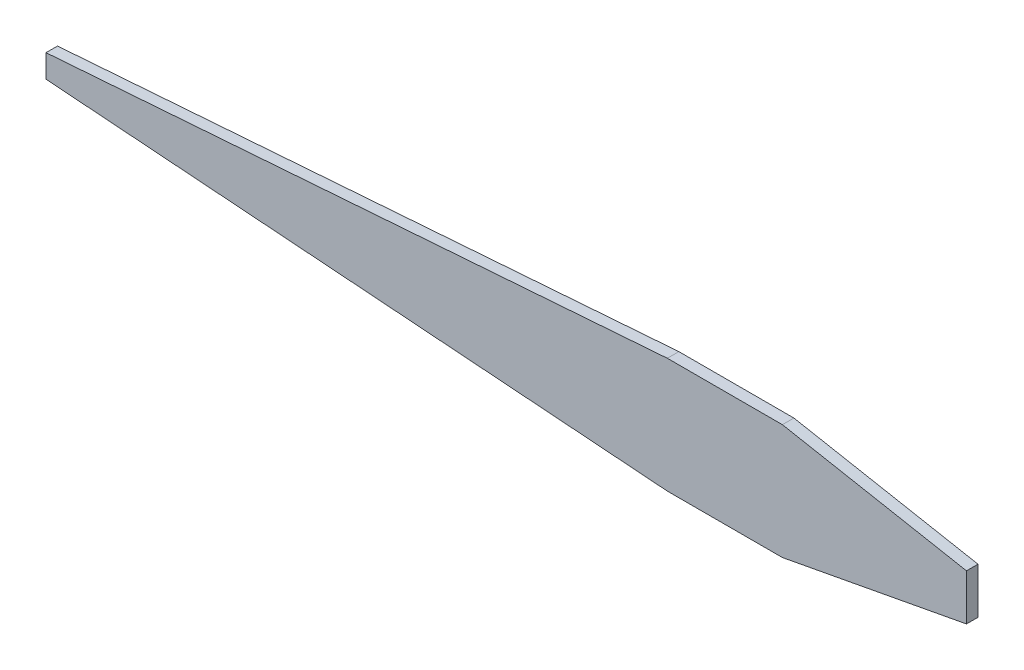
ISO-10303-21;
HEADER;
FILE_DESCRIPTION(('STEP AP214'),'2;1');
FILE_NAME('part.step','',(''),(''),'','','');
FILE_SCHEMA(('AUTOMOTIVE_DESIGN { 1 0 10303 214 1 1 1 1 }'));
ENDSEC;
DATA;
#1=APPLICATION_CONTEXT('core data for automotive mechanical design processes');
#2=APPLICATION_PROTOCOL_DEFINITION('international standard','automotive_design',2000,#1);
#3=PRODUCT_CONTEXT('',#1,'mechanical');
#4=PRODUCT('Part','Part','',(#3));
#5=PRODUCT_RELATED_PRODUCT_CATEGORY('part','',(#4));
#6=PRODUCT_DEFINITION_FORMATION('','',#4);
#7=PRODUCT_DEFINITION_CONTEXT('part definition',#1,'design');
#8=PRODUCT_DEFINITION('design','',#6,#7);
#9=PRODUCT_DEFINITION_SHAPE('','',#8);
#10=(LENGTH_UNIT() NAMED_UNIT(*) SI_UNIT(.MILLI.,.METRE.));
#11=(NAMED_UNIT(*) PLANE_ANGLE_UNIT() SI_UNIT($,.RADIAN.));
#12=(NAMED_UNIT(*) SI_UNIT($,.STERADIAN.) SOLID_ANGLE_UNIT());
#13=UNCERTAINTY_MEASURE_WITH_UNIT(LENGTH_MEASURE(1.E-05),#10,'distance_accuracy_value','');
#14=(GEOMETRIC_REPRESENTATION_CONTEXT(3) GLOBAL_UNCERTAINTY_ASSIGNED_CONTEXT((#13)) GLOBAL_UNIT_ASSIGNED_CONTEXT((#10,
#11,#12)) REPRESENTATION_CONTEXT('',''));
#15=CARTESIAN_POINT('',(0.,0.,0.));
#16=DIRECTION('',(0.,0.,1.));
#17=DIRECTION('',(1.,0.,0.));
#18=AXIS2_PLACEMENT_3D('',#15,#16,#17);
#19=CARTESIAN_POINT('',(200.,-20.,5.));
#20=DIRECTION('',(-1.,0.,0.));
#21=DIRECTION('',(0.,0.,1.));
#22=AXIS2_PLACEMENT_3D('',#19,#20,#21);
#23=PLANE('',#22);
#24=DIRECTION('',(0.,1.,0.));
#25=VECTOR('',#24,1.);
#26=CARTESIAN_POINT('',(200.,-20.,-5.));
#27=LINE('',#26,#25);
#28=CARTESIAN_POINT('',(200.,-20.,-5.));
#29=VERTEX_POINT('',#28);
#30=CARTESIAN_POINT('',(200.,20.,-5.));
#31=VERTEX_POINT('',#30);
#32=EDGE_CURVE('E133',#29,#31,#27,.T.);
#33=ORIENTED_EDGE('',*,*,#32,.T.);
#34=DIRECTION('',(0.,0.,-1.));
#35=VECTOR('',#34,1.);
#36=CARTESIAN_POINT('',(200.,20.,5.));
#37=LINE('',#36,#35);
#38=CARTESIAN_POINT('',(200.,20.,5.));
#39=VERTEX_POINT('',#38);
#40=EDGE_CURVE('E11',#39,#31,#37,.T.);
#41=ORIENTED_EDGE('',*,*,#40,.F.);
#42=DIRECTION('',(0.,1.,0.));
#43=VECTOR('',#42,1.);
#44=CARTESIAN_POINT('',(200.,-20.,5.));
#45=LINE('',#44,#43);
#46=CARTESIAN_POINT('',(200.,-20.,5.));
#47=VERTEX_POINT('',#46);
#48=EDGE_CURVE('E147',#47,#39,#45,.T.);
#49=ORIENTED_EDGE('',*,*,#48,.F.);
#50=DIRECTION('',(0.,0.,-1.));
#51=VECTOR('',#50,1.);
#52=CARTESIAN_POINT('',(200.,-20.,5.));
#53=LINE('',#52,#51);
#54=EDGE_CURVE('E129',#47,#29,#53,.T.);
#55=ORIENTED_EDGE('',*,*,#54,.T.);
#56=EDGE_LOOP('',(#33,#41,#49,#55));
#57=FACE_BOUND('',#56,.T.);
#58=ADVANCED_FACE('F37',(#57),#23,.F.);
#59=CARTESIAN_POINT('',(200.,20.,5.));
#60=DIRECTION('',(-0.184288535050185,-0.982872186934322,0.));
#61=DIRECTION('',(0.982872186934322,-0.184288535050185,0.));
#62=AXIS2_PLACEMENT_3D('',#59,#60,#61);
#63=PLANE('',#62);
#64=DIRECTION('',(-0.982872186934322,0.184288535050185,0.));
#65=VECTOR('',#64,1.);
#66=CARTESIAN_POINT('',(200.,20.,-5.));
#67=LINE('',#66,#65);
#68=CARTESIAN_POINT('',(40.,50.,-5.));
#69=VERTEX_POINT('',#68);
#70=EDGE_CURVE('E136',#31,#69,#67,.T.);
#71=ORIENTED_EDGE('',*,*,#70,.T.);
#72=DIRECTION('',(0.,0.,-1.));
#73=VECTOR('',#72,1.);
#74=CARTESIAN_POINT('',(40.,50.,5.));
#75=LINE('',#74,#73);
#76=CARTESIAN_POINT('',(40.,50.,5.));
#77=VERTEX_POINT('',#76);
#78=EDGE_CURVE('E45',#77,#69,#75,.T.);
#79=ORIENTED_EDGE('',*,*,#78,.F.);
#80=DIRECTION('',(-0.982872186934322,0.184288535050185,0.));
#81=VECTOR('',#80,1.);
#82=CARTESIAN_POINT('',(200.,20.,5.));
#83=LINE('',#82,#81);
#84=EDGE_CURVE('E96',#39,#77,#83,.T.);
#85=ORIENTED_EDGE('',*,*,#84,.F.);
#86=ORIENTED_EDGE('',*,*,#40,.T.);
#87=EDGE_LOOP('',(#71,#79,#85,#86));
#88=FACE_BOUND('',#87,.T.);
#89=ADVANCED_FACE('F182',(#88),#63,.F.);
#90=CARTESIAN_POINT('',(40.,50.,5.));
#91=DIRECTION('',(0.,-1.,0.));
#92=DIRECTION('',(1.,0.,0.));
#93=AXIS2_PLACEMENT_3D('',#90,#91,#92);
#94=PLANE('',#93);
#95=DIRECTION('',(-1.,0.,0.));
#96=VECTOR('',#95,1.);
#97=CARTESIAN_POINT('',(40.,50.,-5.));
#98=LINE('',#97,#96);
#99=CARTESIAN_POINT('',(-60.,50.,-5.));
#100=VERTEX_POINT('',#99);
#101=EDGE_CURVE('E138',#69,#100,#98,.T.);
#102=ORIENTED_EDGE('',*,*,#101,.T.);
#103=DIRECTION('',(0.,0.,-1.));
#104=VECTOR('',#103,1.);
#105=CARTESIAN_POINT('',(-60.,50.,5.));
#106=LINE('',#105,#104);
#107=CARTESIAN_POINT('',(-60.,50.,5.));
#108=VERTEX_POINT('',#107);
#109=EDGE_CURVE('E154',#108,#100,#106,.T.);
#110=ORIENTED_EDGE('',*,*,#109,.F.);
#111=DIRECTION('',(-1.,0.,0.));
#112=VECTOR('',#111,1.);
#113=CARTESIAN_POINT('',(40.,50.,5.));
#114=LINE('',#113,#112);
#115=EDGE_CURVE('E162',#77,#108,#114,.T.);
#116=ORIENTED_EDGE('',*,*,#115,.F.);
#117=ORIENTED_EDGE('',*,*,#78,.T.);
#118=EDGE_LOOP('',(#102,#110,#116,#117));
#119=FACE_BOUND('',#118,.T.);
#120=ADVANCED_FACE('F160',(#119),#94,.F.);
#121=CARTESIAN_POINT('',(-60.,50.,5.));
#122=DIRECTION('',(0.0738716855153118,-0.997267754456709,0.));
#123=DIRECTION('',(0.997267754456709,0.0738716855153118,0.));
#124=AXIS2_PLACEMENT_3D('',#121,#122,#123);
#125=PLANE('',#124);
#126=DIRECTION('',(-0.997267754456709,-0.0738716855153118,0.));
#127=VECTOR('',#126,1.);
#128=CARTESIAN_POINT('',(-60.,50.,-5.));
#129=LINE('',#128,#127);
#130=CARTESIAN_POINT('',(-600.,10.,-5.));
#131=VERTEX_POINT('',#130);
#132=EDGE_CURVE('E140',#100,#131,#129,.T.);
#133=ORIENTED_EDGE('',*,*,#132,.T.);
#134=DIRECTION('',(0.,0.,-1.));
#135=VECTOR('',#134,1.);
#136=CARTESIAN_POINT('',(-600.,10.,5.));
#137=LINE('',#136,#135);
#138=CARTESIAN_POINT('',(-600.,10.,5.));
#139=VERTEX_POINT('',#138);
#140=EDGE_CURVE('E151',#139,#131,#137,.T.);
#141=ORIENTED_EDGE('',*,*,#140,.F.);
#142=DIRECTION('',(-0.997267754456709,-0.0738716855153118,0.));
#143=VECTOR('',#142,1.);
#144=CARTESIAN_POINT('',(-60.,50.,5.));
#145=LINE('',#144,#143);
#146=EDGE_CURVE('E174',#108,#139,#145,.T.);
#147=ORIENTED_EDGE('',*,*,#146,.F.);
#148=ORIENTED_EDGE('',*,*,#109,.T.);
#149=EDGE_LOOP('',(#133,#141,#147,#148));
#150=FACE_BOUND('',#149,.T.);
#151=ADVANCED_FACE('F170',(#150),#125,.F.);
#152=CARTESIAN_POINT('',(-600.,10.,5.));
#153=DIRECTION('',(1.,0.,0.));
#154=DIRECTION('',(0.,0.,-1.));
#155=AXIS2_PLACEMENT_3D('',#152,#153,#154);
#156=PLANE('',#155);
#157=DIRECTION('',(0.,-1.,0.));
#158=VECTOR('',#157,1.);
#159=CARTESIAN_POINT('',(-600.,10.,-5.));
#160=LINE('',#159,#158);
#161=CARTESIAN_POINT('',(-600.,-10.,-5.));
#162=VERTEX_POINT('',#161);
#163=EDGE_CURVE('E142',#131,#162,#160,.T.);
#164=ORIENTED_EDGE('',*,*,#163,.T.);
#165=DIRECTION('',(0.,0.,-1.));
#166=VECTOR('',#165,1.);
#167=CARTESIAN_POINT('',(-600.,-10.,5.));
#168=LINE('',#167,#166);
#169=CARTESIAN_POINT('',(-600.,-10.,5.));
#170=VERTEX_POINT('',#169);
#171=EDGE_CURVE('E124',#170,#162,#168,.T.);
#172=ORIENTED_EDGE('',*,*,#171,.F.);
#173=DIRECTION('',(0.,-1.,0.));
#174=VECTOR('',#173,1.);
#175=CARTESIAN_POINT('',(-600.,10.,5.));
#176=LINE('',#175,#174);
#177=EDGE_CURVE('E115',#139,#170,#176,.T.);
#178=ORIENTED_EDGE('',*,*,#177,.F.);
#179=ORIENTED_EDGE('',*,*,#140,.T.);
#180=EDGE_LOOP('',(#164,#172,#178,#179));
#181=FACE_BOUND('',#180,.T.);
#182=ADVANCED_FACE('F173',(#181),#156,.F.);
#183=CARTESIAN_POINT('',(-600.,-10.,5.));
#184=DIRECTION('',(0.0738716855153118,0.997267754456709,0.));
#185=DIRECTION('',(-0.997267754456709,0.0738716855153118,0.));
#186=AXIS2_PLACEMENT_3D('',#183,#184,#185);
#187=PLANE('',#186);
#188=DIRECTION('',(0.997267754456709,-0.0738716855153118,0.));
#189=VECTOR('',#188,1.);
#190=CARTESIAN_POINT('',(-600.,-10.,-5.));
#191=LINE('',#190,#189);
#192=CARTESIAN_POINT('',(-60.,-50.,-5.));
#193=VERTEX_POINT('',#192);
#194=EDGE_CURVE('E123',#162,#193,#191,.T.);
#195=ORIENTED_EDGE('',*,*,#194,.T.);
#196=DIRECTION('',(0.,0.,-1.));
#197=VECTOR('',#196,1.);
#198=CARTESIAN_POINT('',(-60.,-50.,5.));
#199=LINE('',#198,#197);
#200=CARTESIAN_POINT('',(-60.,-50.,5.));
#201=VERTEX_POINT('',#200);
#202=EDGE_CURVE('E120',#201,#193,#199,.T.);
#203=ORIENTED_EDGE('',*,*,#202,.F.);
#204=DIRECTION('',(0.997267754456709,-0.0738716855153118,0.));
#205=VECTOR('',#204,1.);
#206=CARTESIAN_POINT('',(-600.,-10.,5.));
#207=LINE('',#206,#205);
#208=EDGE_CURVE('E109',#170,#201,#207,.T.);
#209=ORIENTED_EDGE('',*,*,#208,.F.);
#210=ORIENTED_EDGE('',*,*,#171,.T.);
#211=EDGE_LOOP('',(#195,#203,#209,#210));
#212=FACE_BOUND('',#211,.T.);
#213=ADVANCED_FACE('F121',(#212),#187,.F.);
#214=CARTESIAN_POINT('',(-60.,-50.,5.));
#215=DIRECTION('',(0.,1.,0.));
#216=DIRECTION('',(-1.,0.,0.));
#217=AXIS2_PLACEMENT_3D('',#214,#215,#216);
#218=PLANE('',#217);
#219=DIRECTION('',(1.,0.,0.));
#220=VECTOR('',#219,1.);
#221=CARTESIAN_POINT('',(-60.,-50.,-5.));
#222=LINE('',#221,#220);
#223=CARTESIAN_POINT('',(40.,-50.,-5.));
#224=VERTEX_POINT('',#223);
#225=EDGE_CURVE('E82',#193,#224,#222,.T.);
#226=ORIENTED_EDGE('',*,*,#225,.T.);
#227=DIRECTION('',(0.,0.,-1.));
#228=VECTOR('',#227,1.);
#229=CARTESIAN_POINT('',(40.,-50.,5.));
#230=LINE('',#229,#228);
#231=CARTESIAN_POINT('',(40.,-50.,5.));
#232=VERTEX_POINT('',#231);
#233=EDGE_CURVE('E125',#232,#224,#230,.T.);
#234=ORIENTED_EDGE('',*,*,#233,.F.);
#235=DIRECTION('',(1.,0.,0.));
#236=VECTOR('',#235,1.);
#237=CARTESIAN_POINT('',(-60.,-50.,5.));
#238=LINE('',#237,#236);
#239=EDGE_CURVE('E113',#201,#232,#238,.T.);
#240=ORIENTED_EDGE('',*,*,#239,.F.);
#241=ORIENTED_EDGE('',*,*,#202,.T.);
#242=EDGE_LOOP('',(#226,#234,#240,#241));
#243=FACE_BOUND('',#242,.T.);
#244=ADVANCED_FACE('F127',(#243),#218,.F.);
#245=CARTESIAN_POINT('',(40.,-50.,5.));
#246=DIRECTION('',(-0.184288535050185,0.982872186934322,0.));
#247=DIRECTION('',(-0.982872186934322,-0.184288535050185,0.));
#248=AXIS2_PLACEMENT_3D('',#245,#246,#247);
#249=PLANE('',#248);
#250=DIRECTION('',(0.982872186934322,0.184288535050185,0.));
#251=VECTOR('',#250,1.);
#252=CARTESIAN_POINT('',(40.,-50.,-5.));
#253=LINE('',#252,#251);
#254=EDGE_CURVE('E88',#224,#29,#253,.T.);
#255=ORIENTED_EDGE('',*,*,#254,.T.);
#256=ORIENTED_EDGE('',*,*,#54,.F.);
#257=DIRECTION('',(0.982872186934322,0.184288535050185,0.));
#258=VECTOR('',#257,1.);
#259=CARTESIAN_POINT('',(40.,-50.,5.));
#260=LINE('',#259,#258);
#261=EDGE_CURVE('E53',#232,#47,#260,.T.);
#262=ORIENTED_EDGE('',*,*,#261,.F.);
#263=ORIENTED_EDGE('',*,*,#233,.T.);
#264=EDGE_LOOP('',(#255,#256,#262,#263));
#265=FACE_BOUND('',#264,.T.);
#266=ADVANCED_FACE('F198',(#265),#249,.F.);
#267=CARTESIAN_POINT('',(0.,0.,5.));
#268=DIRECTION('',(0.,0.,1.));
#269=DIRECTION('',(1.,0.,0.));
#270=AXIS2_PLACEMENT_3D('',#267,#268,#269);
#271=PLANE('',#270);
#272=ORIENTED_EDGE('',*,*,#48,.T.);
#273=ORIENTED_EDGE('',*,*,#84,.T.);
#274=ORIENTED_EDGE('',*,*,#115,.T.);
#275=ORIENTED_EDGE('',*,*,#146,.T.);
#276=ORIENTED_EDGE('',*,*,#177,.T.);
#277=ORIENTED_EDGE('',*,*,#208,.T.);
#278=ORIENTED_EDGE('',*,*,#239,.T.);
#279=ORIENTED_EDGE('',*,*,#261,.T.);
#280=EDGE_LOOP('',(#272,#273,#274,#275,#276,#277,#278,#279));
#281=FACE_BOUND('',#280,.T.);
#282=ADVANCED_FACE('F111',(#281),#271,.T.);
#283=CARTESIAN_POINT('',(0.,0.,-5.));
#284=DIRECTION('',(0.,0.,1.));
#285=DIRECTION('',(1.,0.,0.));
#286=AXIS2_PLACEMENT_3D('',#283,#284,#285);
#287=PLANE('',#286);
#288=ORIENTED_EDGE('',*,*,#32,.F.);
#289=ORIENTED_EDGE('',*,*,#254,.F.);
#290=ORIENTED_EDGE('',*,*,#225,.F.);
#291=ORIENTED_EDGE('',*,*,#194,.F.);
#292=ORIENTED_EDGE('',*,*,#163,.F.);
#293=ORIENTED_EDGE('',*,*,#132,.F.);
#294=ORIENTED_EDGE('',*,*,#101,.F.);
#295=ORIENTED_EDGE('',*,*,#70,.F.);
#296=EDGE_LOOP('',(#288,#289,#290,#291,#292,#293,#294,#295));
#297=FACE_BOUND('',#296,.T.);
#298=ADVANCED_FACE('F166',(#297),#287,.F.);
#299=CLOSED_SHELL('',(#58,#89,#120,#151,#182,#213,#244,#266,#282,#298));
#300=MANIFOLD_SOLID_BREP('B2',#299);
#301=ADVANCED_BREP_SHAPE_REPRESENTATION('',(#18,#300),#14);
#302=SHAPE_DEFINITION_REPRESENTATION(#9,#301);
ENDSEC;
END-ISO-10303-21;
